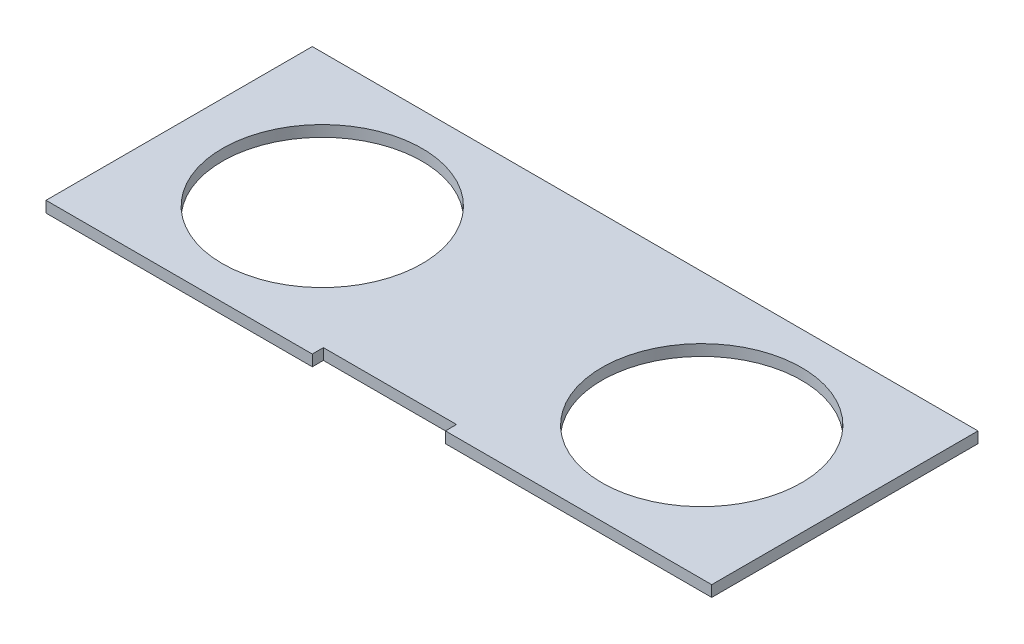
ISO-10303-21;
HEADER;
FILE_DESCRIPTION(('STEP AP214'),'2;1');
FILE_NAME('part.step','',(''),(''),'','','');
FILE_SCHEMA(('AUTOMOTIVE_DESIGN { 1 0 10303 214 1 1 1 1 }'));
ENDSEC;
DATA;
#1=APPLICATION_CONTEXT('core data for automotive mechanical design processes');
#2=APPLICATION_PROTOCOL_DEFINITION('international standard','automotive_design',2000,#1);
#3=PRODUCT_CONTEXT('',#1,'mechanical');
#4=PRODUCT('Part','Part','',(#3));
#5=PRODUCT_RELATED_PRODUCT_CATEGORY('part','',(#4));
#6=PRODUCT_DEFINITION_FORMATION('','',#4);
#7=PRODUCT_DEFINITION_CONTEXT('part definition',#1,'design');
#8=PRODUCT_DEFINITION('design','',#6,#7);
#9=PRODUCT_DEFINITION_SHAPE('','',#8);
#10=(LENGTH_UNIT() NAMED_UNIT(*) SI_UNIT(.MILLI.,.METRE.));
#11=(NAMED_UNIT(*) PLANE_ANGLE_UNIT() SI_UNIT($,.RADIAN.));
#12=(NAMED_UNIT(*) SI_UNIT($,.STERADIAN.) SOLID_ANGLE_UNIT());
#13=UNCERTAINTY_MEASURE_WITH_UNIT(LENGTH_MEASURE(1.E-05),#10,'distance_accuracy_value','');
#14=(GEOMETRIC_REPRESENTATION_CONTEXT(3) GLOBAL_UNCERTAINTY_ASSIGNED_CONTEXT((#13)) GLOBAL_UNIT_ASSIGNED_CONTEXT((#10,
#11,#12)) REPRESENTATION_CONTEXT('',''));
#15=CARTESIAN_POINT('',(0.,0.,0.));
#16=DIRECTION('',(0.,0.,1.));
#17=DIRECTION('',(1.,0.,0.));
#18=AXIS2_PLACEMENT_3D('',#15,#16,#17);
#19=CARTESIAN_POINT('',(-300.,5.,0.));
#20=DIRECTION('',(0.,0.,-1.));
#21=DIRECTION('',(-1.,0.,0.));
#22=AXIS2_PLACEMENT_3D('',#19,#20,#21);
#23=PLANE('',#22);
#24=DIRECTION('',(1.,0.,0.));
#25=VECTOR('',#24,1.);
#26=CARTESIAN_POINT('',(-300.,5.,0.));
#27=LINE('',#26,#25);
#28=CARTESIAN_POINT('',(-120.,5.,0.));
#29=VERTEX_POINT('',#28);
#30=CARTESIAN_POINT('',(0.,5.,0.));
#31=VERTEX_POINT('',#30);
#32=EDGE_CURVE('E164',#29,#31,#27,.T.);
#33=ORIENTED_EDGE('',*,*,#32,.F.);
#34=DIRECTION('',(0.,1.,0.));
#35=VECTOR('',#34,1.);
#36=CARTESIAN_POINT('',(-120.,0.,0.));
#37=LINE('',#36,#35);
#38=CARTESIAN_POINT('',(-120.,0.,0.));
#39=VERTEX_POINT('',#38);
#40=EDGE_CURVE('E153',#39,#29,#37,.T.);
#41=ORIENTED_EDGE('',*,*,#40,.F.);
#42=DIRECTION('',(1.,0.,0.));
#43=VECTOR('',#42,1.);
#44=CARTESIAN_POINT('',(-300.,0.,0.));
#45=LINE('',#44,#43);
#46=CARTESIAN_POINT('',(0.,0.,0.));
#47=VERTEX_POINT('',#46);
#48=EDGE_CURVE('E136',#39,#47,#45,.T.);
#49=ORIENTED_EDGE('',*,*,#48,.T.);
#50=DIRECTION('',(0.,-1.,0.));
#51=VECTOR('',#50,1.);
#52=CARTESIAN_POINT('',(0.,5.,0.));
#53=LINE('',#52,#51);
#54=EDGE_CURVE('E47',#31,#47,#53,.T.);
#55=ORIENTED_EDGE('',*,*,#54,.F.);
#56=EDGE_LOOP('',(#33,#41,#49,#55));
#57=FACE_BOUND('',#56,.T.);
#58=ADVANCED_FACE('F38',(#57),#23,.F.);
#59=CARTESIAN_POINT('',(-300.,5.,-120.));
#60=DIRECTION('',(1.,0.,0.));
#61=DIRECTION('',(0.,0.,-1.));
#62=AXIS2_PLACEMENT_3D('',#59,#60,#61);
#63=PLANE('',#62);
#64=DIRECTION('',(0.,0.,1.));
#65=VECTOR('',#64,1.);
#66=CARTESIAN_POINT('',(-300.,0.,-120.));
#67=LINE('',#66,#65);
#68=CARTESIAN_POINT('',(-300.,0.,-120.));
#69=VERTEX_POINT('',#68);
#70=CARTESIAN_POINT('',(-300.,0.,0.));
#71=VERTEX_POINT('',#70);
#72=EDGE_CURVE('E173',#69,#71,#67,.T.);
#73=ORIENTED_EDGE('',*,*,#72,.T.);
#74=DIRECTION('',(0.,-1.,0.));
#75=VECTOR('',#74,1.);
#76=CARTESIAN_POINT('',(-300.,5.,0.));
#77=LINE('',#76,#75);
#78=CARTESIAN_POINT('',(-300.,5.,0.));
#79=VERTEX_POINT('',#78);
#80=EDGE_CURVE('E11',#79,#71,#77,.T.);
#81=ORIENTED_EDGE('',*,*,#80,.F.);
#82=DIRECTION('',(0.,0.,1.));
#83=VECTOR('',#82,1.);
#84=CARTESIAN_POINT('',(-300.,5.,-120.));
#85=LINE('',#84,#83);
#86=CARTESIAN_POINT('',(-300.,5.,-120.));
#87=VERTEX_POINT('',#86);
#88=EDGE_CURVE('E161',#87,#79,#85,.T.);
#89=ORIENTED_EDGE('',*,*,#88,.F.);
#90=DIRECTION('',(0.,-1.,0.));
#91=VECTOR('',#90,1.);
#92=CARTESIAN_POINT('',(-300.,5.,-120.));
#93=LINE('',#92,#91);
#94=EDGE_CURVE('E172',#87,#69,#93,.T.);
#95=ORIENTED_EDGE('',*,*,#94,.T.);
#96=EDGE_LOOP('',(#73,#81,#89,#95));
#97=FACE_BOUND('',#96,.T.);
#98=ADVANCED_FACE('F40',(#97),#63,.F.);
#99=CARTESIAN_POINT('',(-180.,0.,0.));
#100=VERTEX_POINT('',#99);
#101=EDGE_CURVE('E178',#71,#100,#45,.T.);
#102=ORIENTED_EDGE('',*,*,#101,.T.);
#103=DIRECTION('',(0.,1.,0.));
#104=VECTOR('',#103,1.);
#105=CARTESIAN_POINT('',(-180.,0.,0.));
#106=LINE('',#105,#104);
#107=CARTESIAN_POINT('',(-180.,5.,0.));
#108=VERTEX_POINT('',#107);
#109=EDGE_CURVE('E156',#100,#108,#106,.T.);
#110=ORIENTED_EDGE('',*,*,#109,.T.);
#111=EDGE_CURVE('E91',#79,#108,#27,.T.);
#112=ORIENTED_EDGE('',*,*,#111,.F.);
#113=ORIENTED_EDGE('',*,*,#80,.T.);
#114=EDGE_LOOP('',(#102,#110,#112,#113));
#115=FACE_BOUND('',#114,.T.);
#116=ADVANCED_FACE('F215',(#115),#23,.F.);
#117=CARTESIAN_POINT('',(0.,5.,-120.));
#118=DIRECTION('',(-1.,0.,0.));
#119=DIRECTION('',(0.,0.,1.));
#120=AXIS2_PLACEMENT_3D('',#117,#118,#119);
#121=PLANE('',#120);
#122=DIRECTION('',(0.,0.,-1.));
#123=VECTOR('',#122,1.);
#124=CARTESIAN_POINT('',(0.,0.,-120.));
#125=LINE('',#124,#123);
#126=CARTESIAN_POINT('',(0.,0.,-120.));
#127=VERTEX_POINT('',#126);
#128=EDGE_CURVE('E182',#47,#127,#125,.T.);
#129=ORIENTED_EDGE('',*,*,#128,.T.);
#130=DIRECTION('',(0.,-1.,0.));
#131=VECTOR('',#130,1.);
#132=CARTESIAN_POINT('',(0.,5.,-120.));
#133=LINE('',#132,#131);
#134=CARTESIAN_POINT('',(0.,5.,-120.));
#135=VERTEX_POINT('',#134);
#136=EDGE_CURVE('E189',#135,#127,#133,.T.);
#137=ORIENTED_EDGE('',*,*,#136,.F.);
#138=DIRECTION('',(0.,0.,-1.));
#139=VECTOR('',#138,1.);
#140=CARTESIAN_POINT('',(0.,5.,-120.));
#141=LINE('',#140,#139);
#142=EDGE_CURVE('E167',#31,#135,#141,.T.);
#143=ORIENTED_EDGE('',*,*,#142,.F.);
#144=ORIENTED_EDGE('',*,*,#54,.T.);
#145=EDGE_LOOP('',(#129,#137,#143,#144));
#146=FACE_BOUND('',#145,.T.);
#147=ADVANCED_FACE('F196',(#146),#121,.F.);
#148=CARTESIAN_POINT('',(-300.,5.,-120.));
#149=DIRECTION('',(0.,0.,1.));
#150=DIRECTION('',(1.,0.,0.));
#151=AXIS2_PLACEMENT_3D('',#148,#149,#150);
#152=PLANE('',#151);
#153=DIRECTION('',(-1.,0.,0.));
#154=VECTOR('',#153,1.);
#155=CARTESIAN_POINT('',(-300.,0.,-120.));
#156=LINE('',#155,#154);
#157=EDGE_CURVE('E84',#127,#69,#156,.T.);
#158=ORIENTED_EDGE('',*,*,#157,.T.);
#159=ORIENTED_EDGE('',*,*,#94,.F.);
#160=DIRECTION('',(-1.,0.,0.));
#161=VECTOR('',#160,1.);
#162=CARTESIAN_POINT('',(-300.,5.,-120.));
#163=LINE('',#162,#161);
#164=EDGE_CURVE('E63',#135,#87,#163,.T.);
#165=ORIENTED_EDGE('',*,*,#164,.F.);
#166=ORIENTED_EDGE('',*,*,#136,.T.);
#167=EDGE_LOOP('',(#158,#159,#165,#166));
#168=FACE_BOUND('',#167,.T.);
#169=ADVANCED_FACE('F204',(#168),#152,.F.);
#170=CARTESIAN_POINT('',(0.,5.,0.));
#171=DIRECTION('',(0.,1.,0.));
#172=DIRECTION('',(0.,0.,1.));
#173=AXIS2_PLACEMENT_3D('',#170,#171,#172);
#174=PLANE('',#173);
#175=CARTESIAN_POINT('',(-64.5,5.,-60.0000000000001));
#176=DIRECTION('',(0.,1.,0.));
#177=DIRECTION('',(0.,0.,1.));
#178=AXIS2_PLACEMENT_3D('',#175,#176,#177);
#179=CIRCLE('',#178,45.);
#180=CARTESIAN_POINT('',(-64.5,5.,-15.));
#181=VERTEX_POINT('',#180);
#182=EDGE_CURVE('E251',#181,#181,#179,.T.);
#183=ORIENTED_EDGE('',*,*,#182,.F.);
#184=EDGE_LOOP('',(#183));
#185=FACE_BOUND('',#184,.T.);
#186=CARTESIAN_POINT('',(-235.5,5.,-60.0000000000001));
#187=DIRECTION('',(0.,1.,0.));
#188=DIRECTION('',(0.,0.,1.));
#189=AXIS2_PLACEMENT_3D('',#186,#187,#188);
#190=CIRCLE('',#189,45.);
#191=CARTESIAN_POINT('',(-235.5,5.,-15.0000000000001));
#192=VERTEX_POINT('',#191);
#193=EDGE_CURVE('E144',#192,#192,#190,.T.);
#194=ORIENTED_EDGE('',*,*,#193,.F.);
#195=EDGE_LOOP('',(#194));
#196=FACE_BOUND('',#195,.T.);
#197=DIRECTION('',(0.,0.,-1.));
#198=VECTOR('',#197,1.);
#199=CARTESIAN_POINT('',(-120.,5.,0.));
#200=LINE('',#199,#198);
#201=CARTESIAN_POINT('',(-120.,5.,-5.00000000000002));
#202=VERTEX_POINT('',#201);
#203=EDGE_CURVE('E120',#29,#202,#200,.T.);
#204=ORIENTED_EDGE('',*,*,#203,.F.);
#205=ORIENTED_EDGE('',*,*,#32,.T.);
#206=ORIENTED_EDGE('',*,*,#142,.T.);
#207=ORIENTED_EDGE('',*,*,#164,.T.);
#208=ORIENTED_EDGE('',*,*,#88,.T.);
#209=ORIENTED_EDGE('',*,*,#111,.T.);
#210=DIRECTION('',(0.,0.,1.));
#211=VECTOR('',#210,1.);
#212=CARTESIAN_POINT('',(-180.,5.,0.));
#213=LINE('',#212,#211);
#214=CARTESIAN_POINT('',(-180.,5.,-5.));
#215=VERTEX_POINT('',#214);
#216=EDGE_CURVE('E138',#215,#108,#213,.T.);
#217=ORIENTED_EDGE('',*,*,#216,.F.);
#218=DIRECTION('',(-1.,0.,0.));
#219=VECTOR('',#218,1.);
#220=CARTESIAN_POINT('',(-120.,5.,-5.00000000000002));
#221=LINE('',#220,#219);
#222=EDGE_CURVE('E141',#202,#215,#221,.T.);
#223=ORIENTED_EDGE('',*,*,#222,.F.);
#224=EDGE_LOOP('',(#204,#205,#206,#207,#208,#209,#217,#223));
#225=FACE_BOUND('',#224,.T.);
#226=ADVANCED_FACE('F206',(#185,#196,#225),#174,.T.);
#227=CARTESIAN_POINT('',(0.,0.,0.));
#228=DIRECTION('',(0.,1.,0.));
#229=DIRECTION('',(0.,0.,1.));
#230=AXIS2_PLACEMENT_3D('',#227,#228,#229);
#231=PLANE('',#230);
#232=CARTESIAN_POINT('',(-64.5,0.,-60.0000000000001));
#233=DIRECTION('',(0.,1.,0.));
#234=DIRECTION('',(0.,0.,1.));
#235=AXIS2_PLACEMENT_3D('',#232,#233,#234);
#236=CIRCLE('',#235,45.);
#237=CARTESIAN_POINT('',(-64.5,0.,-15.));
#238=VERTEX_POINT('',#237);
#239=EDGE_CURVE('E177',#238,#238,#236,.T.);
#240=ORIENTED_EDGE('',*,*,#239,.T.);
#241=EDGE_LOOP('',(#240));
#242=FACE_BOUND('',#241,.T.);
#243=CARTESIAN_POINT('',(-235.5,0.,-60.0000000000001));
#244=DIRECTION('',(0.,1.,0.));
#245=DIRECTION('',(0.,0.,1.));
#246=AXIS2_PLACEMENT_3D('',#243,#244,#245);
#247=CIRCLE('',#246,45.);
#248=CARTESIAN_POINT('',(-235.5,0.,-15.0000000000001));
#249=VERTEX_POINT('',#248);
#250=EDGE_CURVE('E248',#249,#249,#247,.T.);
#251=ORIENTED_EDGE('',*,*,#250,.T.);
#252=EDGE_LOOP('',(#251));
#253=FACE_BOUND('',#252,.T.);
#254=ORIENTED_EDGE('',*,*,#48,.F.);
#255=DIRECTION('',(0.,0.,-1.));
#256=VECTOR('',#255,1.);
#257=CARTESIAN_POINT('',(-120.,0.,0.));
#258=LINE('',#257,#256);
#259=CARTESIAN_POINT('',(-120.,0.,-5.00000000000002));
#260=VERTEX_POINT('',#259);
#261=EDGE_CURVE('E117',#39,#260,#258,.T.);
#262=ORIENTED_EDGE('',*,*,#261,.T.);
#263=DIRECTION('',(-1.,0.,0.));
#264=VECTOR('',#263,1.);
#265=CARTESIAN_POINT('',(-120.,0.,-5.00000000000002));
#266=LINE('',#265,#264);
#267=CARTESIAN_POINT('',(-180.,0.,-5.));
#268=VERTEX_POINT('',#267);
#269=EDGE_CURVE('E128',#260,#268,#266,.T.);
#270=ORIENTED_EDGE('',*,*,#269,.T.);
#271=DIRECTION('',(0.,0.,1.));
#272=VECTOR('',#271,1.);
#273=CARTESIAN_POINT('',(-180.,0.,0.));
#274=LINE('',#273,#272);
#275=EDGE_CURVE('E54',#268,#100,#274,.T.);
#276=ORIENTED_EDGE('',*,*,#275,.T.);
#277=ORIENTED_EDGE('',*,*,#101,.F.);
#278=ORIENTED_EDGE('',*,*,#72,.F.);
#279=ORIENTED_EDGE('',*,*,#157,.F.);
#280=ORIENTED_EDGE('',*,*,#128,.F.);
#281=EDGE_LOOP('',(#254,#262,#270,#276,#277,#278,#279,#280));
#282=FACE_BOUND('',#281,.T.);
#283=ADVANCED_FACE('F134',(#242,#253,#282),#231,.F.);
#284=CARTESIAN_POINT('',(-120.,0.,0.));
#285=DIRECTION('',(1.,0.,0.));
#286=DIRECTION('',(0.,0.,-1.));
#287=AXIS2_PLACEMENT_3D('',#284,#285,#286);
#288=PLANE('',#287);
#289=ORIENTED_EDGE('',*,*,#203,.T.);
#290=DIRECTION('',(0.,1.,0.));
#291=VECTOR('',#290,1.);
#292=CARTESIAN_POINT('',(-120.,0.,-5.00000000000002));
#293=LINE('',#292,#291);
#294=EDGE_CURVE('E113',#260,#202,#293,.T.);
#295=ORIENTED_EDGE('',*,*,#294,.F.);
#296=ORIENTED_EDGE('',*,*,#261,.F.);
#297=ORIENTED_EDGE('',*,*,#40,.T.);
#298=EDGE_LOOP('',(#289,#295,#296,#297));
#299=FACE_BOUND('',#298,.T.);
#300=ADVANCED_FACE('F115',(#299),#288,.F.);
#301=CARTESIAN_POINT('',(-180.,0.,0.));
#302=DIRECTION('',(-1.,0.,0.));
#303=DIRECTION('',(0.,0.,1.));
#304=AXIS2_PLACEMENT_3D('',#301,#302,#303);
#305=PLANE('',#304);
#306=ORIENTED_EDGE('',*,*,#216,.T.);
#307=ORIENTED_EDGE('',*,*,#109,.F.);
#308=ORIENTED_EDGE('',*,*,#275,.F.);
#309=DIRECTION('',(0.,1.,0.));
#310=VECTOR('',#309,1.);
#311=CARTESIAN_POINT('',(-180.,0.,-5.));
#312=LINE('',#311,#310);
#313=EDGE_CURVE('E125',#268,#215,#312,.T.);
#314=ORIENTED_EDGE('',*,*,#313,.T.);
#315=EDGE_LOOP('',(#306,#307,#308,#314));
#316=FACE_BOUND('',#315,.T.);
#317=ADVANCED_FACE('F226',(#316),#305,.F.);
#318=CARTESIAN_POINT('',(-120.,0.,-5.00000000000002));
#319=DIRECTION('',(0.,0.,-1.));
#320=DIRECTION('',(-1.,0.,0.));
#321=AXIS2_PLACEMENT_3D('',#318,#319,#320);
#322=PLANE('',#321);
#323=ORIENTED_EDGE('',*,*,#222,.T.);
#324=ORIENTED_EDGE('',*,*,#313,.F.);
#325=ORIENTED_EDGE('',*,*,#269,.F.);
#326=ORIENTED_EDGE('',*,*,#294,.T.);
#327=EDGE_LOOP('',(#323,#324,#325,#326));
#328=FACE_BOUND('',#327,.T.);
#329=ADVANCED_FACE('F129',(#328),#322,.F.);
#330=CARTESIAN_POINT('',(-235.5,0.,-60.0000000000001));
#331=DIRECTION('',(0.,1.,0.));
#332=DIRECTION('',(0.,0.,1.));
#333=AXIS2_PLACEMENT_3D('',#330,#331,#332);
#334=CYLINDRICAL_SURFACE('',#333,45.);
#335=ORIENTED_EDGE('',*,*,#250,.F.);
#336=EDGE_LOOP('',(#335));
#337=FACE_BOUND('',#336,.T.);
#338=ORIENTED_EDGE('',*,*,#193,.T.);
#339=EDGE_LOOP('',(#338));
#340=FACE_BOUND('',#339,.T.);
#341=ADVANCED_FACE('F233',(#337,#340),#334,.F.);
#342=CARTESIAN_POINT('',(-64.5,0.,-60.0000000000001));
#343=DIRECTION('',(0.,1.,0.));
#344=DIRECTION('',(0.,0.,1.));
#345=AXIS2_PLACEMENT_3D('',#342,#343,#344);
#346=CYLINDRICAL_SURFACE('',#345,45.);
#347=ORIENTED_EDGE('',*,*,#239,.F.);
#348=EDGE_LOOP('',(#347));
#349=FACE_BOUND('',#348,.T.);
#350=ORIENTED_EDGE('',*,*,#182,.T.);
#351=EDGE_LOOP('',(#350));
#352=FACE_BOUND('',#351,.T.);
#353=ADVANCED_FACE('F265',(#349,#352),#346,.F.);
#354=CLOSED_SHELL('',(#58,#98,#116,#147,#169,#226,#283,#300,#317,#329,#341,#353));
#355=MANIFOLD_SOLID_BREP('B2',#354);
#356=ADVANCED_BREP_SHAPE_REPRESENTATION('',(#18,#355),#14);
#357=SHAPE_DEFINITION_REPRESENTATION(#9,#356);
ENDSEC;
END-ISO-10303-21;
